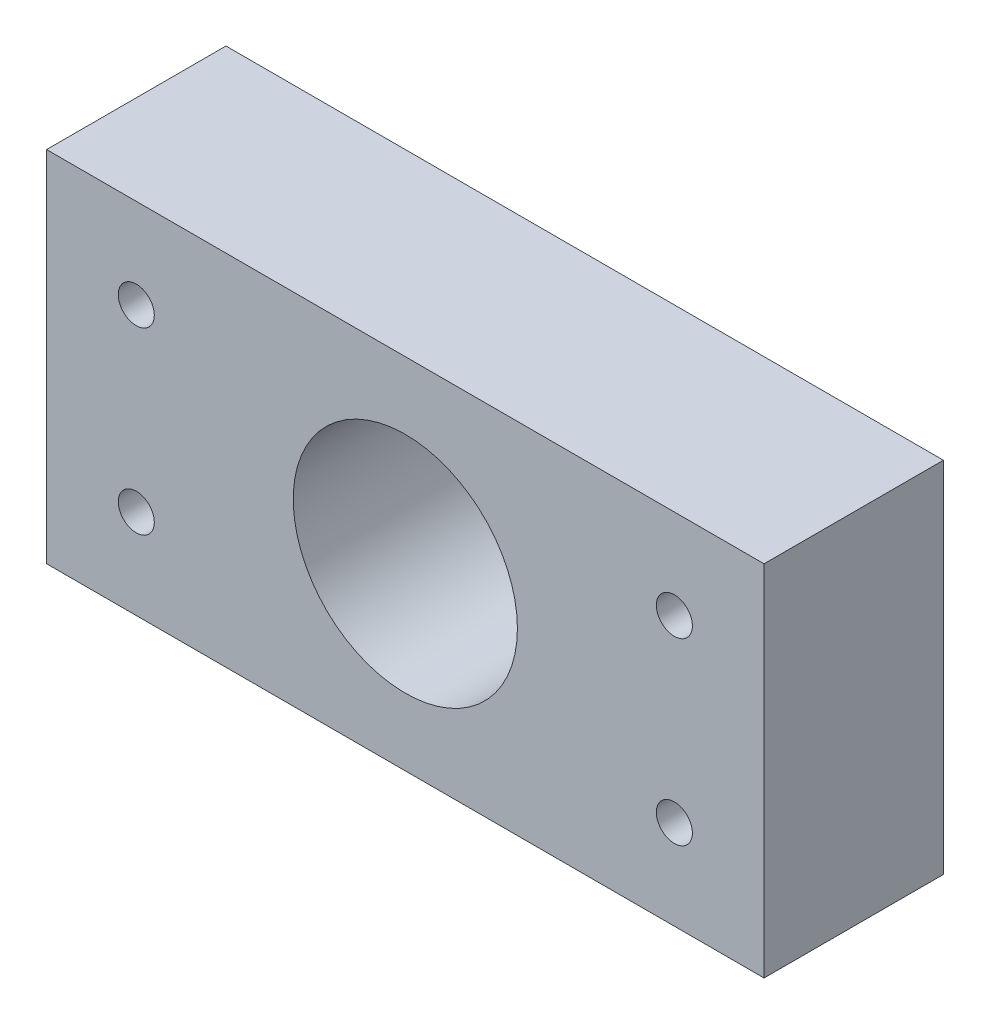
ISO-10303-21;
HEADER;
FILE_DESCRIPTION(('STEP AP214'),'2;1');
FILE_NAME('part.step','',(''),(''),'','','');
FILE_SCHEMA(('AUTOMOTIVE_DESIGN { 1 0 10303 214 1 1 1 1 }'));
ENDSEC;
DATA;
#1=APPLICATION_CONTEXT('core data for automotive mechanical design processes');
#2=APPLICATION_PROTOCOL_DEFINITION('international standard','automotive_design',2000,#1);
#3=PRODUCT_CONTEXT('',#1,'mechanical');
#4=PRODUCT('Part','Part','',(#3));
#5=PRODUCT_RELATED_PRODUCT_CATEGORY('part','',(#4));
#6=PRODUCT_DEFINITION_FORMATION('','',#4);
#7=PRODUCT_DEFINITION_CONTEXT('part definition',#1,'design');
#8=PRODUCT_DEFINITION('design','',#6,#7);
#9=PRODUCT_DEFINITION_SHAPE('','',#8);
#10=(LENGTH_UNIT() NAMED_UNIT(*) SI_UNIT(.MILLI.,.METRE.));
#11=(NAMED_UNIT(*) PLANE_ANGLE_UNIT() SI_UNIT($,.RADIAN.));
#12=(NAMED_UNIT(*) SI_UNIT($,.STERADIAN.) SOLID_ANGLE_UNIT());
#13=UNCERTAINTY_MEASURE_WITH_UNIT(LENGTH_MEASURE(1.E-05),#10,'distance_accuracy_value','');
#14=(GEOMETRIC_REPRESENTATION_CONTEXT(3) GLOBAL_UNCERTAINTY_ASSIGNED_CONTEXT((#13)) GLOBAL_UNIT_ASSIGNED_CONTEXT((#10,
#11,#12)) REPRESENTATION_CONTEXT('',''));
#15=CARTESIAN_POINT('',(0.,0.,0.));
#16=DIRECTION('',(0.,0.,1.));
#17=DIRECTION('',(1.,0.,0.));
#18=AXIS2_PLACEMENT_3D('',#15,#16,#17);
#19=CARTESIAN_POINT('',(-50.8,25.4,12.7));
#20=DIRECTION('',(-1.,0.,0.));
#21=DIRECTION('',(0.,0.,1.));
#22=AXIS2_PLACEMENT_3D('',#19,#20,#21);
#23=PLANE('',#22);
#24=DIRECTION('',(0.,0.,-1.));
#25=VECTOR('',#24,1.);
#26=CARTESIAN_POINT('',(-50.8,-25.4,12.7));
#27=LINE('',#26,#25);
#28=CARTESIAN_POINT('',(-50.8,-25.4,12.7));
#29=VERTEX_POINT('',#28);
#30=CARTESIAN_POINT('',(-50.8,-25.4,-12.7));
#31=VERTEX_POINT('',#30);
#32=EDGE_CURVE('E110',#29,#31,#27,.T.);
#33=ORIENTED_EDGE('',*,*,#32,.F.);
#34=DIRECTION('',(0.,-1.,0.));
#35=VECTOR('',#34,1.);
#36=CARTESIAN_POINT('',(-50.8,25.4,12.7));
#37=LINE('',#36,#35);
#38=CARTESIAN_POINT('',(-50.8,25.4,12.7));
#39=VERTEX_POINT('',#38);
#40=EDGE_CURVE('E11',#39,#29,#37,.T.);
#41=ORIENTED_EDGE('',*,*,#40,.F.);
#42=DIRECTION('',(0.,0.,-1.));
#43=VECTOR('',#42,1.);
#44=CARTESIAN_POINT('',(-50.8,25.4,12.7));
#45=LINE('',#44,#43);
#46=CARTESIAN_POINT('',(-50.8,25.4,-12.7));
#47=VERTEX_POINT('',#46);
#48=EDGE_CURVE('E102',#39,#47,#45,.T.);
#49=ORIENTED_EDGE('',*,*,#48,.T.);
#50=DIRECTION('',(0.,-1.,0.));
#51=VECTOR('',#50,1.);
#52=CARTESIAN_POINT('',(-50.8,25.4,-12.7));
#53=LINE('',#52,#51);
#54=EDGE_CURVE('E41',#47,#31,#53,.T.);
#55=ORIENTED_EDGE('',*,*,#54,.T.);
#56=EDGE_LOOP('',(#33,#41,#49,#55));
#57=FACE_BOUND('',#56,.T.);
#58=ADVANCED_FACE('F38',(#57),#23,.T.);
#59=CARTESIAN_POINT('',(-50.8,25.4,12.7));
#60=DIRECTION('',(0.,0.,-1.));
#61=DIRECTION('',(-1.,0.,0.));
#62=AXIS2_PLACEMENT_3D('',#59,#60,#61);
#63=PLANE('',#62);
#64=CARTESIAN_POINT('',(-38.1,12.7,12.7));
#65=DIRECTION('',(0.,0.,1.));
#66=DIRECTION('',(1.,0.,0.));
#67=AXIS2_PLACEMENT_3D('',#64,#65,#66);
#68=CIRCLE('',#67,2.5527);
#69=CARTESIAN_POINT('',(-35.5473,12.7,12.7));
#70=VERTEX_POINT('',#69);
#71=EDGE_CURVE('E191',#70,#70,#68,.T.);
#72=ORIENTED_EDGE('',*,*,#71,.F.);
#73=EDGE_LOOP('',(#72));
#74=FACE_BOUND('',#73,.T.);
#75=CARTESIAN_POINT('',(-38.1,-12.7,12.7));
#76=DIRECTION('',(0.,0.,1.));
#77=DIRECTION('',(1.,0.,0.));
#78=AXIS2_PLACEMENT_3D('',#75,#76,#77);
#79=CIRCLE('',#78,2.5527);
#80=CARTESIAN_POINT('',(-35.5473,-12.7,12.7));
#81=VERTEX_POINT('',#80);
#82=EDGE_CURVE('E185',#81,#81,#79,.T.);
#83=ORIENTED_EDGE('',*,*,#82,.F.);
#84=EDGE_LOOP('',(#83));
#85=FACE_BOUND('',#84,.T.);
#86=CARTESIAN_POINT('',(38.1,12.7,12.7));
#87=DIRECTION('',(0.,0.,1.));
#88=DIRECTION('',(1.,0.,0.));
#89=AXIS2_PLACEMENT_3D('',#86,#87,#88);
#90=CIRCLE('',#89,2.5527);
#91=CARTESIAN_POINT('',(40.6527,12.7,12.7));
#92=VERTEX_POINT('',#91);
#93=EDGE_CURVE('E179',#92,#92,#90,.T.);
#94=ORIENTED_EDGE('',*,*,#93,.F.);
#95=EDGE_LOOP('',(#94));
#96=FACE_BOUND('',#95,.T.);
#97=CARTESIAN_POINT('',(38.1,-12.7,12.7));
#98=DIRECTION('',(0.,0.,1.));
#99=DIRECTION('',(1.,0.,0.));
#100=AXIS2_PLACEMENT_3D('',#97,#98,#99);
#101=CIRCLE('',#100,2.5527);
#102=CARTESIAN_POINT('',(40.6527,-12.7,12.7));
#103=VERTEX_POINT('',#102);
#104=EDGE_CURVE('E171',#103,#103,#101,.T.);
#105=ORIENTED_EDGE('',*,*,#104,.F.);
#106=EDGE_LOOP('',(#105));
#107=FACE_BOUND('',#106,.T.);
#108=CARTESIAN_POINT('',(0.,0.,12.7));
#109=DIRECTION('',(0.,0.,1.));
#110=DIRECTION('',(1.,0.,0.));
#111=AXIS2_PLACEMENT_3D('',#108,#109,#110);
#112=CIRCLE('',#111,15.875);
#113=CARTESIAN_POINT('',(15.875,0.,12.7));
#114=VERTEX_POINT('',#113);
#115=EDGE_CURVE('E115',#114,#114,#112,.T.);
#116=ORIENTED_EDGE('',*,*,#115,.F.);
#117=EDGE_LOOP('',(#116));
#118=FACE_BOUND('',#117,.T.);
#119=DIRECTION('',(1.,0.,0.));
#120=VECTOR('',#119,1.);
#121=CARTESIAN_POINT('',(-50.8,-25.4,12.7));
#122=LINE('',#121,#120);
#123=CARTESIAN_POINT('',(50.8,-25.4,12.7));
#124=VERTEX_POINT('',#123);
#125=EDGE_CURVE('E72',#29,#124,#122,.T.);
#126=ORIENTED_EDGE('',*,*,#125,.T.);
#127=DIRECTION('',(0.,-1.,0.));
#128=VECTOR('',#127,1.);
#129=CARTESIAN_POINT('',(50.8,25.4,12.7));
#130=LINE('',#129,#128);
#131=CARTESIAN_POINT('',(50.8,25.4,12.7));
#132=VERTEX_POINT('',#131);
#133=EDGE_CURVE('E48',#132,#124,#130,.T.);
#134=ORIENTED_EDGE('',*,*,#133,.F.);
#135=DIRECTION('',(1.,0.,0.));
#136=VECTOR('',#135,1.);
#137=CARTESIAN_POINT('',(-50.8,25.4,12.7));
#138=LINE('',#137,#136);
#139=EDGE_CURVE('E89',#39,#132,#138,.T.);
#140=ORIENTED_EDGE('',*,*,#139,.F.);
#141=ORIENTED_EDGE('',*,*,#40,.T.);
#142=EDGE_LOOP('',(#126,#134,#140,#141));
#143=FACE_BOUND('',#142,.T.);
#144=ADVANCED_FACE('F127',(#74,#85,#96,#107,#118,#143),#63,.F.);
#145=CARTESIAN_POINT('',(50.8,25.4,12.7));
#146=DIRECTION('',(-1.,0.,0.));
#147=DIRECTION('',(0.,0.,1.));
#148=AXIS2_PLACEMENT_3D('',#145,#146,#147);
#149=PLANE('',#148);
#150=DIRECTION('',(0.,0.,-1.));
#151=VECTOR('',#150,1.);
#152=CARTESIAN_POINT('',(50.8,-25.4,12.7));
#153=LINE('',#152,#151);
#154=CARTESIAN_POINT('',(50.8,-25.4,-12.7));
#155=VERTEX_POINT('',#154);
#156=EDGE_CURVE('E97',#124,#155,#153,.T.);
#157=ORIENTED_EDGE('',*,*,#156,.T.);
#158=DIRECTION('',(0.,-1.,0.));
#159=VECTOR('',#158,1.);
#160=CARTESIAN_POINT('',(50.8,25.4,-12.7));
#161=LINE('',#160,#159);
#162=CARTESIAN_POINT('',(50.8,25.4,-12.7));
#163=VERTEX_POINT('',#162);
#164=EDGE_CURVE('E94',#163,#155,#161,.T.);
#165=ORIENTED_EDGE('',*,*,#164,.F.);
#166=DIRECTION('',(0.,0.,-1.));
#167=VECTOR('',#166,1.);
#168=CARTESIAN_POINT('',(50.8,25.4,12.7));
#169=LINE('',#168,#167);
#170=EDGE_CURVE('E84',#132,#163,#169,.T.);
#171=ORIENTED_EDGE('',*,*,#170,.F.);
#172=ORIENTED_EDGE('',*,*,#133,.T.);
#173=EDGE_LOOP('',(#157,#165,#171,#172));
#174=FACE_BOUND('',#173,.T.);
#175=ADVANCED_FACE('F95',(#174),#149,.F.);
#176=CARTESIAN_POINT('',(-50.8,25.4,-12.7));
#177=DIRECTION('',(0.,0.,-1.));
#178=DIRECTION('',(-1.,0.,0.));
#179=AXIS2_PLACEMENT_3D('',#176,#177,#178);
#180=PLANE('',#179);
#181=CARTESIAN_POINT('',(-38.1,12.7,-12.7));
#182=DIRECTION('',(0.,0.,1.));
#183=DIRECTION('',(1.,0.,0.));
#184=AXIS2_PLACEMENT_3D('',#181,#182,#183);
#185=CIRCLE('',#184,2.55269999999999);
#186=CARTESIAN_POINT('',(-35.5473,12.7,-12.7));
#187=VERTEX_POINT('',#186);
#188=EDGE_CURVE('E149',#187,#187,#185,.T.);
#189=ORIENTED_EDGE('',*,*,#188,.T.);
#190=EDGE_LOOP('',(#189));
#191=FACE_BOUND('',#190,.T.);
#192=CARTESIAN_POINT('',(-38.1,-12.7,-12.7));
#193=DIRECTION('',(0.,0.,1.));
#194=DIRECTION('',(1.,0.,0.));
#195=AXIS2_PLACEMENT_3D('',#192,#193,#194);
#196=CIRCLE('',#195,2.55269999999999);
#197=CARTESIAN_POINT('',(-35.5473,-12.7,-12.7));
#198=VERTEX_POINT('',#197);
#199=EDGE_CURVE('E153',#198,#198,#196,.T.);
#200=ORIENTED_EDGE('',*,*,#199,.T.);
#201=EDGE_LOOP('',(#200));
#202=FACE_BOUND('',#201,.T.);
#203=CARTESIAN_POINT('',(38.1,12.7,-12.7));
#204=DIRECTION('',(0.,0.,1.));
#205=DIRECTION('',(1.,0.,0.));
#206=AXIS2_PLACEMENT_3D('',#203,#204,#205);
#207=CIRCLE('',#206,2.55269999999999);
#208=CARTESIAN_POINT('',(40.6527,12.7,-12.7));
#209=VERTEX_POINT('',#208);
#210=EDGE_CURVE('E157',#209,#209,#207,.T.);
#211=ORIENTED_EDGE('',*,*,#210,.T.);
#212=EDGE_LOOP('',(#211));
#213=FACE_BOUND('',#212,.T.);
#214=CARTESIAN_POINT('',(38.1,-12.7,-12.7));
#215=DIRECTION('',(0.,0.,1.));
#216=DIRECTION('',(1.,0.,0.));
#217=AXIS2_PLACEMENT_3D('',#214,#215,#216);
#218=CIRCLE('',#217,2.55269999999999);
#219=CARTESIAN_POINT('',(40.6527,-12.7,-12.7));
#220=VERTEX_POINT('',#219);
#221=EDGE_CURVE('E161',#220,#220,#218,.T.);
#222=ORIENTED_EDGE('',*,*,#221,.T.);
#223=EDGE_LOOP('',(#222));
#224=FACE_BOUND('',#223,.T.);
#225=CARTESIAN_POINT('',(0.,0.,-12.7));
#226=DIRECTION('',(0.,0.,-1.));
#227=DIRECTION('',(-1.,0.,0.));
#228=AXIS2_PLACEMENT_3D('',#225,#226,#227);
#229=CIRCLE('',#228,15.875);
#230=CARTESIAN_POINT('',(15.875,0.,-12.7));
#231=VERTEX_POINT('',#230);
#232=EDGE_CURVE('E164',#231,#231,#229,.F.);
#233=ORIENTED_EDGE('',*,*,#232,.T.);
#234=EDGE_LOOP('',(#233));
#235=FACE_BOUND('',#234,.T.);
#236=DIRECTION('',(1.,0.,0.));
#237=VECTOR('',#236,1.);
#238=CARTESIAN_POINT('',(-50.8,-25.4,-12.7));
#239=LINE('',#238,#237);
#240=EDGE_CURVE('E114',#31,#155,#239,.T.);
#241=ORIENTED_EDGE('',*,*,#240,.F.);
#242=ORIENTED_EDGE('',*,*,#54,.F.);
#243=DIRECTION('',(1.,0.,0.));
#244=VECTOR('',#243,1.);
#245=CARTESIAN_POINT('',(-50.8,25.4,-12.7));
#246=LINE('',#245,#244);
#247=EDGE_CURVE('E88',#47,#163,#246,.T.);
#248=ORIENTED_EDGE('',*,*,#247,.T.);
#249=ORIENTED_EDGE('',*,*,#164,.T.);
#250=EDGE_LOOP('',(#241,#242,#248,#249));
#251=FACE_BOUND('',#250,.T.);
#252=ADVANCED_FACE('F100',(#191,#202,#213,#224,#235,#251),#180,.T.);
#253=CARTESIAN_POINT('',(0.,25.4,0.));
#254=DIRECTION('',(0.,-1.,0.));
#255=DIRECTION('',(0.,0.,-1.));
#256=AXIS2_PLACEMENT_3D('',#253,#254,#255);
#257=PLANE('',#256);
#258=ORIENTED_EDGE('',*,*,#48,.F.);
#259=ORIENTED_EDGE('',*,*,#139,.T.);
#260=ORIENTED_EDGE('',*,*,#170,.T.);
#261=ORIENTED_EDGE('',*,*,#247,.F.);
#262=EDGE_LOOP('',(#258,#259,#260,#261));
#263=FACE_BOUND('',#262,.T.);
#264=ADVANCED_FACE('F87',(#263),#257,.F.);
#265=CARTESIAN_POINT('',(0.,-25.4,0.));
#266=DIRECTION('',(0.,-1.,0.));
#267=DIRECTION('',(0.,0.,-1.));
#268=AXIS2_PLACEMENT_3D('',#265,#266,#267);
#269=PLANE('',#268);
#270=ORIENTED_EDGE('',*,*,#32,.T.);
#271=ORIENTED_EDGE('',*,*,#240,.T.);
#272=ORIENTED_EDGE('',*,*,#156,.F.);
#273=ORIENTED_EDGE('',*,*,#125,.F.);
#274=EDGE_LOOP('',(#270,#271,#272,#273));
#275=FACE_BOUND('',#274,.T.);
#276=ADVANCED_FACE('F124',(#275),#269,.T.);
#277=CARTESIAN_POINT('',(0.,0.,-12.701));
#278=DIRECTION('',(0.,0.,1.));
#279=DIRECTION('',(1.,0.,0.));
#280=AXIS2_PLACEMENT_3D('',#277,#278,#279);
#281=CYLINDRICAL_SURFACE('',#280,15.875);
#282=CARTESIAN_POINT('',(15.875,0.,-12.7));
#283=CARTESIAN_POINT('',(15.875,0.,-12.4354166666667));
#284=CARTESIAN_POINT('',(15.875,0.,-12.1708333333333));
#285=CARTESIAN_POINT('',(15.875,0.,-11.6416666666667));
#286=CARTESIAN_POINT('',(15.875,0.,-11.3770833333333));
#287=CARTESIAN_POINT('',(15.875,0.,-10.8479166666667));
#288=CARTESIAN_POINT('',(15.875,0.,-10.5833333333333));
#289=CARTESIAN_POINT('',(15.875,0.,-10.0541666666667));
#290=CARTESIAN_POINT('',(15.875,0.,-9.78958333333333));
#291=CARTESIAN_POINT('',(15.875,0.,-9.26041666666666));
#292=CARTESIAN_POINT('',(15.875,0.,-8.99583333333333));
#293=CARTESIAN_POINT('',(15.875,0.,-8.46666666666667));
#294=CARTESIAN_POINT('',(15.875,0.,-8.20208333333333));
#295=CARTESIAN_POINT('',(15.875,0.,-7.67291666666667));
#296=CARTESIAN_POINT('',(15.875,0.,-7.40833333333333));
#297=CARTESIAN_POINT('',(15.875,0.,-6.87916666666667));
#298=CARTESIAN_POINT('',(15.875,0.,-6.61458333333333));
#299=CARTESIAN_POINT('',(15.875,0.,-6.08541666666667));
#300=CARTESIAN_POINT('',(15.875,0.,-5.82083333333333));
#301=CARTESIAN_POINT('',(15.875,0.,-5.29166666666667));
#302=CARTESIAN_POINT('',(15.875,0.,-5.02708333333333));
#303=CARTESIAN_POINT('',(15.875,0.,-4.49791666666667));
#304=CARTESIAN_POINT('',(15.875,0.,-4.23333333333333));
#305=CARTESIAN_POINT('',(15.875,0.,-3.70416666666667));
#306=CARTESIAN_POINT('',(15.875,0.,-3.43958333333333));
#307=CARTESIAN_POINT('',(15.875,0.,-2.91041666666667));
#308=CARTESIAN_POINT('',(15.875,0.,-2.64583333333333));
#309=CARTESIAN_POINT('',(15.875,0.,-2.11666666666667));
#310=CARTESIAN_POINT('',(15.875,0.,-1.85208333333333));
#311=CARTESIAN_POINT('',(15.875,0.,-1.32291666666667));
#312=CARTESIAN_POINT('',(15.875,0.,-1.05833333333333));
#313=CARTESIAN_POINT('',(15.875,0.,-0.529166666666666));
#314=CARTESIAN_POINT('',(15.875,0.,-0.264583333333333));
#315=CARTESIAN_POINT('',(15.875,0.,0.264583333333333));
#316=CARTESIAN_POINT('',(15.875,0.,0.529166666666666));
#317=CARTESIAN_POINT('',(15.875,0.,1.05833333333333));
#318=CARTESIAN_POINT('',(15.875,0.,1.32291666666667));
#319=CARTESIAN_POINT('',(15.875,0.,1.85208333333333));
#320=CARTESIAN_POINT('',(15.875,0.,2.11666666666667));
#321=CARTESIAN_POINT('',(15.875,0.,2.64583333333333));
#322=CARTESIAN_POINT('',(15.875,0.,2.91041666666667));
#323=CARTESIAN_POINT('',(15.875,0.,3.43958333333333));
#324=CARTESIAN_POINT('',(15.875,0.,3.70416666666666));
#325=CARTESIAN_POINT('',(15.875,0.,4.23333333333333));
#326=CARTESIAN_POINT('',(15.875,0.,4.49791666666666));
#327=CARTESIAN_POINT('',(15.875,0.,5.02708333333333));
#328=CARTESIAN_POINT('',(15.875,0.,5.29166666666666));
#329=CARTESIAN_POINT('',(15.875,0.,5.82083333333333));
#330=CARTESIAN_POINT('',(15.875,0.,6.08541666666666));
#331=CARTESIAN_POINT('',(15.875,0.,6.61458333333333));
#332=CARTESIAN_POINT('',(15.875,0.,6.87916666666666));
#333=CARTESIAN_POINT('',(15.875,0.,7.40833333333333));
#334=CARTESIAN_POINT('',(15.875,0.,7.67291666666666));
#335=CARTESIAN_POINT('',(15.875,0.,8.20208333333333));
#336=CARTESIAN_POINT('',(15.875,0.,8.46666666666666));
#337=CARTESIAN_POINT('',(15.875,0.,8.99583333333333));
#338=CARTESIAN_POINT('',(15.875,0.,9.26041666666666));
#339=CARTESIAN_POINT('',(15.875,0.,9.78958333333333));
#340=CARTESIAN_POINT('',(15.875,0.,10.0541666666667));
#341=CARTESIAN_POINT('',(15.875,0.,10.5833333333333));
#342=CARTESIAN_POINT('',(15.875,0.,10.8479166666667));
#343=CARTESIAN_POINT('',(15.875,0.,11.3770833333333));
#344=CARTESIAN_POINT('',(15.875,0.,11.6416666666667));
#345=CARTESIAN_POINT('',(15.875,0.,12.1708333333333));
#346=CARTESIAN_POINT('',(15.875,0.,12.4354166666667));
#347=CARTESIAN_POINT('',(15.875,0.,12.7));
#348=B_SPLINE_CURVE_WITH_KNOTS('',3,(#282,#283,#284,#285,#286,#287,#288,#289,#290,#291,#292,
#293,#294,#295,#296,#297,#298,#299,#300,#301,#302,#303,#304,#305,#306,#307,#308,#309,#310,#311,
#312,#313,#314,#315,#316,#317,#318,#319,#320,#321,#322,#323,#324,#325,#326,#327,#328,#329,#330,
#331,#332,#333,#334,#335,#336,#337,#338,#339,#340,#341,#342,#343,#344,#345,#346,#347),
.UNSPECIFIED.,.F.,.F.,(4,2,2,2,2,2,2,2,2,2,2,2,2,2,2,2,2,2,2,2,2,2,2,2,2,2,2,2,2,2,2,2,4),(0.,
0.793749999999999,1.5875,2.38125,3.175,3.96875,4.7625,5.55625,6.35,7.14375,7.9375,8.73125,9.525,
10.31875,11.1125,11.90625,12.7,13.49375,14.2875,15.08125,15.875,16.66875,17.4625,18.25625,19.05,
19.84375,20.6375,21.43125,22.225,23.01875,23.8125,24.60625,25.4),.UNSPECIFIED.);
#349=EDGE_CURVE('BSEAM213',#231,#114,#348,.T.);
#350=ORIENTED_EDGE('',*,*,#232,.F.);
#351=ORIENTED_EDGE('',*,*,#115,.T.);
#352=ORIENTED_EDGE('',*,*,#349,.T.);
#353=ORIENTED_EDGE('',*,*,#349,.F.);
#354=EDGE_LOOP('',(#350,#352,#351,#353));
#355=FACE_BOUND('',#354,.T.);
#356=ADVANCED_FACE('F213',(#355),#281,.F.);
#357=CARTESIAN_POINT('',(38.1,-12.7,12.7));
#358=DIRECTION('',(0.,0.,1.));
#359=DIRECTION('',(1.,0.,0.));
#360=AXIS2_PLACEMENT_3D('',#357,#358,#359);
#361=CYLINDRICAL_SURFACE('',#360,2.55269999999999);
#362=ORIENTED_EDGE('',*,*,#221,.F.);
#363=EDGE_LOOP('',(#362));
#364=FACE_BOUND('',#363,.T.);
#365=ORIENTED_EDGE('',*,*,#104,.T.);
#366=EDGE_LOOP('',(#365));
#367=FACE_BOUND('',#366,.T.);
#368=ADVANCED_FACE('F209',(#364,#367),#361,.F.);
#369=CARTESIAN_POINT('',(38.1,12.7,12.7));
#370=DIRECTION('',(0.,0.,1.));
#371=DIRECTION('',(1.,0.,0.));
#372=AXIS2_PLACEMENT_3D('',#369,#370,#371);
#373=CYLINDRICAL_SURFACE('',#372,2.55269999999999);
#374=ORIENTED_EDGE('',*,*,#210,.F.);
#375=EDGE_LOOP('',(#374));
#376=FACE_BOUND('',#375,.T.);
#377=ORIENTED_EDGE('',*,*,#93,.T.);
#378=EDGE_LOOP('',(#377));
#379=FACE_BOUND('',#378,.T.);
#380=ADVANCED_FACE('F203',(#376,#379),#373,.F.);
#381=CARTESIAN_POINT('',(-38.1,-12.7,12.7));
#382=DIRECTION('',(0.,0.,1.));
#383=DIRECTION('',(1.,0.,0.));
#384=AXIS2_PLACEMENT_3D('',#381,#382,#383);
#385=CYLINDRICAL_SURFACE('',#384,2.55269999999999);
#386=ORIENTED_EDGE('',*,*,#199,.F.);
#387=EDGE_LOOP('',(#386));
#388=FACE_BOUND('',#387,.T.);
#389=ORIENTED_EDGE('',*,*,#82,.T.);
#390=EDGE_LOOP('',(#389));
#391=FACE_BOUND('',#390,.T.);
#392=ADVANCED_FACE('F197',(#388,#391),#385,.F.);
#393=CARTESIAN_POINT('',(-38.1,12.7,12.7));
#394=DIRECTION('',(0.,0.,1.));
#395=DIRECTION('',(1.,0.,0.));
#396=AXIS2_PLACEMENT_3D('',#393,#394,#395);
#397=CYLINDRICAL_SURFACE('',#396,2.55269999999999);
#398=ORIENTED_EDGE('',*,*,#188,.F.);
#399=EDGE_LOOP('',(#398));
#400=FACE_BOUND('',#399,.T.);
#401=ORIENTED_EDGE('',*,*,#71,.T.);
#402=EDGE_LOOP('',(#401));
#403=FACE_BOUND('',#402,.T.);
#404=ADVANCED_FACE('F195',(#400,#403),#397,.F.);
#405=CLOSED_SHELL('',(#58,#144,#175,#252,#264,#276,#356,#368,#380,#392,#404));
#406=MANIFOLD_SOLID_BREP('B2',#405);
#407=ADVANCED_BREP_SHAPE_REPRESENTATION('',(#18,#406),#14);
#408=SHAPE_DEFINITION_REPRESENTATION(#9,#407);
ENDSEC;
END-ISO-10303-21;
